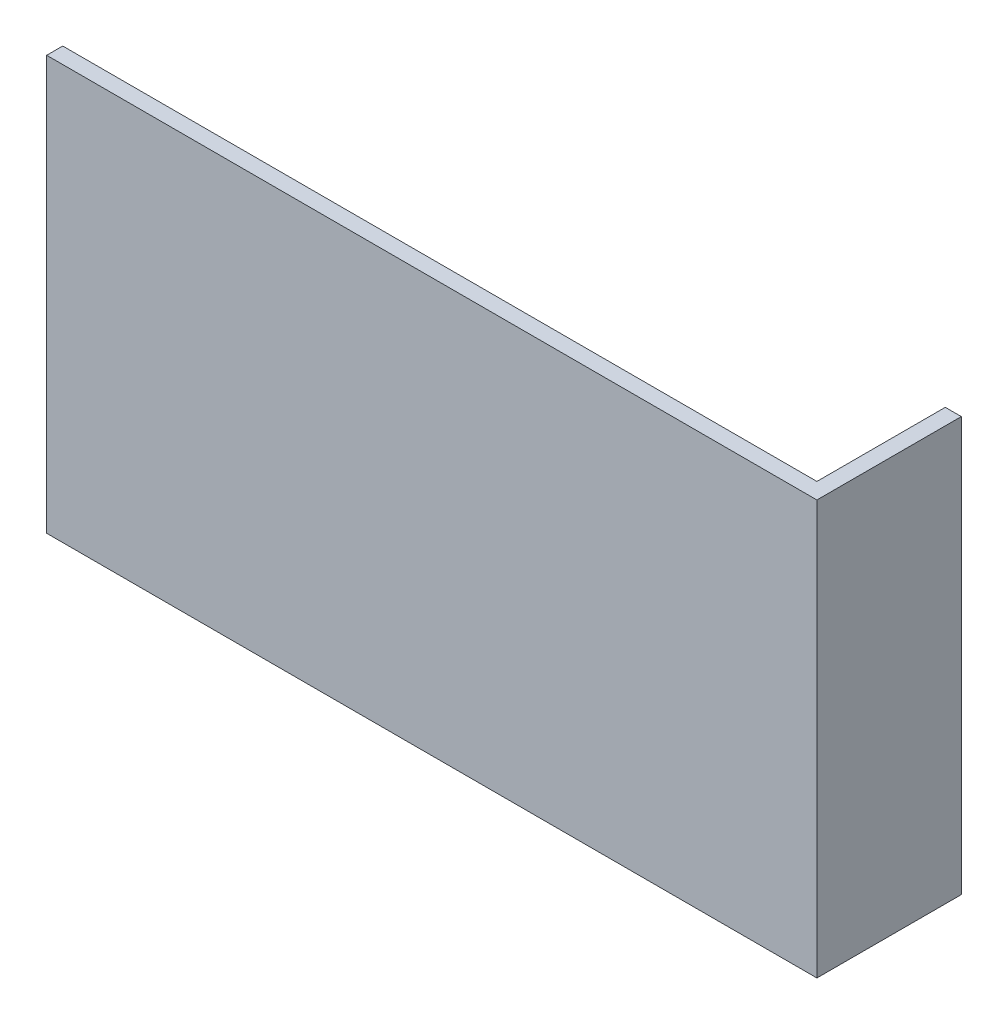
ISO-10303-21;
HEADER;
FILE_DESCRIPTION(('STEP AP214'),'2;1');
FILE_NAME('part.step','',(''),(''),'','','');
FILE_SCHEMA(('AUTOMOTIVE_DESIGN { 1 0 10303 214 1 1 1 1 }'));
ENDSEC;
DATA;
#1=APPLICATION_CONTEXT('core data for automotive mechanical design processes');
#2=APPLICATION_PROTOCOL_DEFINITION('international standard','automotive_design',2000,#1);
#3=PRODUCT_CONTEXT('',#1,'mechanical');
#4=PRODUCT('Part','Part','',(#3));
#5=PRODUCT_RELATED_PRODUCT_CATEGORY('part','',(#4));
#6=PRODUCT_DEFINITION_FORMATION('','',#4);
#7=PRODUCT_DEFINITION_CONTEXT('part definition',#1,'design');
#8=PRODUCT_DEFINITION('design','',#6,#7);
#9=PRODUCT_DEFINITION_SHAPE('','',#8);
#10=(LENGTH_UNIT() NAMED_UNIT(*) SI_UNIT(.MILLI.,.METRE.));
#11=(NAMED_UNIT(*) PLANE_ANGLE_UNIT() SI_UNIT($,.RADIAN.));
#12=(NAMED_UNIT(*) SI_UNIT($,.STERADIAN.) SOLID_ANGLE_UNIT());
#13=UNCERTAINTY_MEASURE_WITH_UNIT(LENGTH_MEASURE(1.E-05),#10,'distance_accuracy_value','');
#14=(GEOMETRIC_REPRESENTATION_CONTEXT(3) GLOBAL_UNCERTAINTY_ASSIGNED_CONTEXT((#13)) GLOBAL_UNIT_ASSIGNED_CONTEXT((#10,
#11,#12)) REPRESENTATION_CONTEXT('',''));
#15=CARTESIAN_POINT('',(0.,0.,0.));
#16=DIRECTION('',(0.,0.,1.));
#17=DIRECTION('',(1.,0.,0.));
#18=AXIS2_PLACEMENT_3D('',#15,#16,#17);
#19=CARTESIAN_POINT('',(-36.4388131406212,-2.20625626437354,3.175));
#20=DIRECTION('',(1.,0.,0.));
#21=DIRECTION('',(0.,0.,-1.));
#22=AXIS2_PLACEMENT_3D('',#19,#20,#21);
#23=PLANE('',#22);
#24=DIRECTION('',(0.,-1.,0.));
#25=VECTOR('',#24,1.);
#26=CARTESIAN_POINT('',(-36.4388131406212,-2.20625626437354,0.));
#27=LINE('',#26,#25);
#28=CARTESIAN_POINT('',(-36.4388131406212,79.7087437356265,0.));
#29=VERTEX_POINT('',#28);
#30=CARTESIAN_POINT('',(-36.4388131406212,-2.20625626437354,0.));
#31=VERTEX_POINT('',#30);
#32=EDGE_CURVE('E127',#29,#31,#27,.T.);
#33=ORIENTED_EDGE('',*,*,#32,.T.);
#34=DIRECTION('',(0.,0.,-1.));
#35=VECTOR('',#34,1.);
#36=CARTESIAN_POINT('',(-36.4388131406212,-2.20625626437354,3.175));
#37=LINE('',#36,#35);
#38=CARTESIAN_POINT('',(-36.4388131406212,-2.20625626437354,3.175));
#39=VERTEX_POINT('',#38);
#40=EDGE_CURVE('E11',#39,#31,#37,.T.);
#41=ORIENTED_EDGE('',*,*,#40,.F.);
#42=DIRECTION('',(0.,-1.,0.));
#43=VECTOR('',#42,1.);
#44=CARTESIAN_POINT('',(-36.4388131406212,-2.20625626437354,3.175));
#45=LINE('',#44,#43);
#46=CARTESIAN_POINT('',(-36.4388131406212,79.7087437356265,3.175));
#47=VERTEX_POINT('',#46);
#48=EDGE_CURVE('E128',#47,#39,#45,.T.);
#49=ORIENTED_EDGE('',*,*,#48,.F.);
#50=DIRECTION('',(0.,0.,-1.));
#51=VECTOR('',#50,1.);
#52=CARTESIAN_POINT('',(-36.4388131406212,79.7087437356265,3.175));
#53=LINE('',#52,#51);
#54=EDGE_CURVE('E133',#47,#29,#53,.T.);
#55=ORIENTED_EDGE('',*,*,#54,.T.);
#56=EDGE_LOOP('',(#33,#41,#49,#55));
#57=FACE_BOUND('',#56,.T.);
#58=ADVANCED_FACE('F39',(#57),#23,.F.);
#59=CARTESIAN_POINT('',(-36.4388131406212,-2.20625626437354,3.175));
#60=DIRECTION('',(0.,1.,0.));
#61=DIRECTION('',(0.,0.,1.));
#62=AXIS2_PLACEMENT_3D('',#59,#60,#61);
#63=PLANE('',#62);
#64=DIRECTION('',(1.,0.,0.));
#65=VECTOR('',#64,1.);
#66=CARTESIAN_POINT('',(-36.4388131406212,-2.20625626437354,0.));
#67=LINE('',#66,#65);
#68=CARTESIAN_POINT('',(112.786186859379,-2.20625626437354,0.));
#69=VERTEX_POINT('',#68);
#70=EDGE_CURVE('E136',#31,#69,#67,.T.);
#71=ORIENTED_EDGE('',*,*,#70,.T.);
#72=DIRECTION('',(0.,0.,1.));
#73=VECTOR('',#72,1.);
#74=CARTESIAN_POINT('',(112.786186859379,-2.20625626437354,-25.4));
#75=LINE('',#74,#73);
#76=CARTESIAN_POINT('',(112.786186859379,-2.20625626437354,-25.4));
#77=VERTEX_POINT('',#76);
#78=EDGE_CURVE('E110',#77,#69,#75,.T.);
#79=ORIENTED_EDGE('',*,*,#78,.F.);
#80=DIRECTION('',(-1.,0.,0.));
#81=VECTOR('',#80,1.);
#82=CARTESIAN_POINT('',(115.961186859379,-2.20625626437354,-25.4));
#83=LINE('',#82,#81);
#84=CARTESIAN_POINT('',(115.961186859379,-2.20625626437354,-25.4));
#85=VERTEX_POINT('',#84);
#86=EDGE_CURVE('E107',#85,#77,#83,.T.);
#87=ORIENTED_EDGE('',*,*,#86,.F.);
#88=DIRECTION('',(0.,0.,-1.));
#89=VECTOR('',#88,1.);
#90=CARTESIAN_POINT('',(115.961186859379,-2.20625626437354,3.175));
#91=LINE('',#90,#89);
#92=CARTESIAN_POINT('',(115.961186859379,-2.20625626437354,3.175));
#93=VERTEX_POINT('',#92);
#94=EDGE_CURVE('E46',#93,#85,#91,.T.);
#95=ORIENTED_EDGE('',*,*,#94,.F.);
#96=DIRECTION('',(1.,0.,0.));
#97=VECTOR('',#96,1.);
#98=CARTESIAN_POINT('',(-36.4388131406212,-2.20625626437354,3.175));
#99=LINE('',#98,#97);
#100=EDGE_CURVE('E82',#39,#93,#99,.T.);
#101=ORIENTED_EDGE('',*,*,#100,.F.);
#102=ORIENTED_EDGE('',*,*,#40,.T.);
#103=EDGE_LOOP('',(#71,#79,#87,#95,#101,#102));
#104=FACE_BOUND('',#103,.T.);
#105=ADVANCED_FACE('F108',(#104),#63,.F.);
#106=CARTESIAN_POINT('',(115.961186859379,-2.20625626437354,3.175));
#107=DIRECTION('',(-1.,0.,0.));
#108=DIRECTION('',(0.,0.,1.));
#109=AXIS2_PLACEMENT_3D('',#106,#107,#108);
#110=PLANE('',#109);
#111=ORIENTED_EDGE('',*,*,#94,.T.);
#112=DIRECTION('',(0.,-1.,0.));
#113=VECTOR('',#112,1.);
#114=CARTESIAN_POINT('',(115.961186859379,79.7087437356265,-25.4));
#115=LINE('',#114,#113);
#116=CARTESIAN_POINT('',(115.961186859379,79.7087437356265,-25.4));
#117=VERTEX_POINT('',#116);
#118=EDGE_CURVE('E103',#117,#85,#115,.T.);
#119=ORIENTED_EDGE('',*,*,#118,.F.);
#120=DIRECTION('',(0.,0.,-1.));
#121=VECTOR('',#120,1.);
#122=CARTESIAN_POINT('',(115.961186859379,79.7087437356265,3.175));
#123=LINE('',#122,#121);
#124=CARTESIAN_POINT('',(115.961186859379,79.7087437356265,3.175));
#125=VERTEX_POINT('',#124);
#126=EDGE_CURVE('E105',#125,#117,#123,.T.);
#127=ORIENTED_EDGE('',*,*,#126,.F.);
#128=DIRECTION('',(0.,1.,0.));
#129=VECTOR('',#128,1.);
#130=CARTESIAN_POINT('',(115.961186859379,-2.20625626437354,3.175));
#131=LINE('',#130,#129);
#132=EDGE_CURVE('E104',#93,#125,#131,.T.);
#133=ORIENTED_EDGE('',*,*,#132,.F.);
#134=EDGE_LOOP('',(#111,#119,#127,#133));
#135=FACE_BOUND('',#134,.T.);
#136=ADVANCED_FACE('F100',(#135),#110,.F.);
#137=CARTESIAN_POINT('',(-36.4388131406212,79.7087437356265,3.175));
#138=DIRECTION('',(0.,-1.,0.));
#139=DIRECTION('',(0.,0.,-1.));
#140=AXIS2_PLACEMENT_3D('',#137,#138,#139);
#141=PLANE('',#140);
#142=ORIENTED_EDGE('',*,*,#126,.T.);
#143=DIRECTION('',(1.,0.,0.));
#144=VECTOR('',#143,1.);
#145=CARTESIAN_POINT('',(115.961186859379,79.7087437356265,-25.4));
#146=LINE('',#145,#144);
#147=CARTESIAN_POINT('',(112.786186859379,79.7087437356265,-25.4));
#148=VERTEX_POINT('',#147);
#149=EDGE_CURVE('E118',#148,#117,#146,.T.);
#150=ORIENTED_EDGE('',*,*,#149,.F.);
#151=DIRECTION('',(0.,0.,1.));
#152=VECTOR('',#151,1.);
#153=CARTESIAN_POINT('',(112.786186859379,79.7087437356265,-25.4));
#154=LINE('',#153,#152);
#155=CARTESIAN_POINT('',(112.786186859379,79.7087437356265,0.));
#156=VERTEX_POINT('',#155);
#157=EDGE_CURVE('E123',#148,#156,#154,.T.);
#158=ORIENTED_EDGE('',*,*,#157,.T.);
#159=DIRECTION('',(-1.,0.,0.));
#160=VECTOR('',#159,1.);
#161=CARTESIAN_POINT('',(-36.4388131406212,79.7087437356265,0.));
#162=LINE('',#161,#160);
#163=EDGE_CURVE('E75',#156,#29,#162,.T.);
#164=ORIENTED_EDGE('',*,*,#163,.T.);
#165=ORIENTED_EDGE('',*,*,#54,.F.);
#166=DIRECTION('',(-1.,0.,0.));
#167=VECTOR('',#166,1.);
#168=CARTESIAN_POINT('',(-36.4388131406212,79.7087437356265,3.175));
#169=LINE('',#168,#167);
#170=EDGE_CURVE('E62',#125,#47,#169,.T.);
#171=ORIENTED_EDGE('',*,*,#170,.F.);
#172=EDGE_LOOP('',(#142,#150,#158,#164,#165,#171));
#173=FACE_BOUND('',#172,.T.);
#174=ADVANCED_FACE('F140',(#173),#141,.F.);
#175=CARTESIAN_POINT('',(0.,0.,3.175));
#176=DIRECTION('',(0.,0.,-1.));
#177=DIRECTION('',(-1.,0.,0.));
#178=AXIS2_PLACEMENT_3D('',#175,#176,#177);
#179=PLANE('',#178);
#180=ORIENTED_EDGE('',*,*,#48,.T.);
#181=ORIENTED_EDGE('',*,*,#100,.T.);
#182=ORIENTED_EDGE('',*,*,#132,.T.);
#183=ORIENTED_EDGE('',*,*,#170,.T.);
#184=EDGE_LOOP('',(#180,#181,#182,#183));
#185=FACE_BOUND('',#184,.T.);
#186=ADVANCED_FACE('F145',(#185),#179,.F.);
#187=CARTESIAN_POINT('',(0.,0.,0.));
#188=DIRECTION('',(0.,0.,-1.));
#189=DIRECTION('',(-1.,0.,0.));
#190=AXIS2_PLACEMENT_3D('',#187,#188,#189);
#191=PLANE('',#190);
#192=DIRECTION('',(0.,1.,0.));
#193=VECTOR('',#192,1.);
#194=CARTESIAN_POINT('',(112.786186859379,79.7087437356265,0.));
#195=LINE('',#194,#193);
#196=EDGE_CURVE('E53',#69,#156,#195,.T.);
#197=ORIENTED_EDGE('',*,*,#196,.F.);
#198=ORIENTED_EDGE('',*,*,#70,.F.);
#199=ORIENTED_EDGE('',*,*,#32,.F.);
#200=ORIENTED_EDGE('',*,*,#163,.F.);
#201=EDGE_LOOP('',(#197,#198,#199,#200));
#202=FACE_BOUND('',#201,.T.);
#203=ADVANCED_FACE('F147',(#202),#191,.T.);
#204=CARTESIAN_POINT('',(112.786186859379,79.7087437356265,-25.4));
#205=DIRECTION('',(1.,0.,0.));
#206=DIRECTION('',(0.,1.,0.));
#207=AXIS2_PLACEMENT_3D('',#204,#205,#206);
#208=PLANE('',#207);
#209=ORIENTED_EDGE('',*,*,#196,.T.);
#210=ORIENTED_EDGE('',*,*,#157,.F.);
#211=DIRECTION('',(0.,1.,0.));
#212=VECTOR('',#211,1.);
#213=CARTESIAN_POINT('',(112.786186859379,79.7087437356265,-25.4));
#214=LINE('',#213,#212);
#215=EDGE_CURVE('E113',#77,#148,#214,.T.);
#216=ORIENTED_EDGE('',*,*,#215,.F.);
#217=ORIENTED_EDGE('',*,*,#78,.T.);
#218=EDGE_LOOP('',(#209,#210,#216,#217));
#219=FACE_BOUND('',#218,.T.);
#220=ADVANCED_FACE('F154',(#219),#208,.F.);
#221=CARTESIAN_POINT('',(0.,0.,-25.4));
#222=DIRECTION('',(0.,0.,-1.));
#223=DIRECTION('',(-1.,0.,0.));
#224=AXIS2_PLACEMENT_3D('',#221,#222,#223);
#225=PLANE('',#224);
#226=ORIENTED_EDGE('',*,*,#118,.T.);
#227=ORIENTED_EDGE('',*,*,#86,.T.);
#228=ORIENTED_EDGE('',*,*,#215,.T.);
#229=ORIENTED_EDGE('',*,*,#149,.T.);
#230=EDGE_LOOP('',(#226,#227,#228,#229));
#231=FACE_BOUND('',#230,.T.);
#232=ADVANCED_FACE('F116',(#231),#225,.T.);
#233=CLOSED_SHELL('',(#58,#105,#136,#174,#186,#203,#220,#232));
#234=MANIFOLD_SOLID_BREP('B2',#233);
#235=ADVANCED_BREP_SHAPE_REPRESENTATION('',(#18,#234),#14);
#236=SHAPE_DEFINITION_REPRESENTATION(#9,#235);
ENDSEC;
END-ISO-10303-21;
